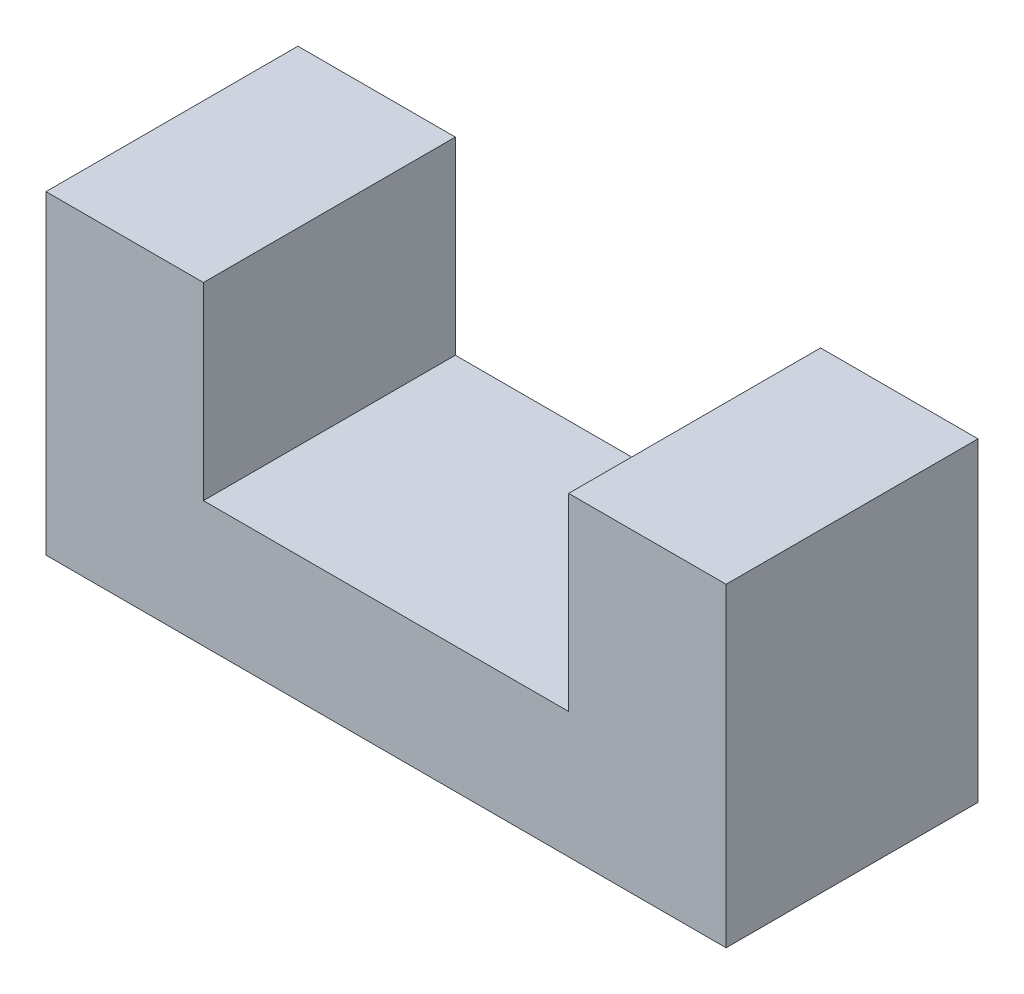
ISO-10303-21;
HEADER;
FILE_DESCRIPTION(('STEP AP214'),'2;1');
FILE_NAME('part.step','',(''),(''),'','','');
FILE_SCHEMA(('AUTOMOTIVE_DESIGN { 1 0 10303 214 1 1 1 1 }'));
ENDSEC;
DATA;
#1=APPLICATION_CONTEXT('core data for automotive mechanical design processes');
#2=APPLICATION_PROTOCOL_DEFINITION('international standard','automotive_design',2000,#1);
#3=PRODUCT_CONTEXT('',#1,'mechanical');
#4=PRODUCT('Part','Part','',(#3));
#5=PRODUCT_RELATED_PRODUCT_CATEGORY('part','',(#4));
#6=PRODUCT_DEFINITION_FORMATION('','',#4);
#7=PRODUCT_DEFINITION_CONTEXT('part definition',#1,'design');
#8=PRODUCT_DEFINITION('design','',#6,#7);
#9=PRODUCT_DEFINITION_SHAPE('','',#8);
#10=(LENGTH_UNIT() NAMED_UNIT(*) SI_UNIT(.MILLI.,.METRE.));
#11=(NAMED_UNIT(*) PLANE_ANGLE_UNIT() SI_UNIT($,.RADIAN.));
#12=(NAMED_UNIT(*) SI_UNIT($,.STERADIAN.) SOLID_ANGLE_UNIT());
#13=UNCERTAINTY_MEASURE_WITH_UNIT(LENGTH_MEASURE(1.E-05),#10,'distance_accuracy_value','');
#14=(GEOMETRIC_REPRESENTATION_CONTEXT(3) GLOBAL_UNCERTAINTY_ASSIGNED_CONTEXT((#13)) GLOBAL_UNIT_ASSIGNED_CONTEXT((#10,
#11,#12)) REPRESENTATION_CONTEXT('',''));
#15=CARTESIAN_POINT('',(0.,0.,0.));
#16=DIRECTION('',(0.,0.,1.));
#17=DIRECTION('',(1.,0.,0.));
#18=AXIS2_PLACEMENT_3D('',#15,#16,#17);
#19=CARTESIAN_POINT('',(0.,-2.,4.));
#20=DIRECTION('',(0.,1.,0.));
#21=DIRECTION('',(0.,0.,1.));
#22=AXIS2_PLACEMENT_3D('',#19,#20,#21);
#23=PLANE('',#22);
#24=DIRECTION('',(1.,0.,0.));
#25=VECTOR('',#24,1.);
#26=CARTESIAN_POINT('',(0.,-2.,0.));
#27=LINE('',#26,#25);
#28=CARTESIAN_POINT('',(-5.4,-2.,0.));
#29=VERTEX_POINT('',#28);
#30=CARTESIAN_POINT('',(5.4,-2.,0.));
#31=VERTEX_POINT('',#30);
#32=EDGE_CURVE('E131',#29,#31,#27,.T.);
#33=ORIENTED_EDGE('',*,*,#32,.T.);
#34=DIRECTION('',(0.,0.,-1.));
#35=VECTOR('',#34,1.);
#36=CARTESIAN_POINT('',(5.4,-2.,4.));
#37=LINE('',#36,#35);
#38=CARTESIAN_POINT('',(5.4,-2.,4.));
#39=VERTEX_POINT('',#38);
#40=EDGE_CURVE('E11',#39,#31,#37,.T.);
#41=ORIENTED_EDGE('',*,*,#40,.F.);
#42=DIRECTION('',(1.,0.,0.));
#43=VECTOR('',#42,1.);
#44=CARTESIAN_POINT('',(0.,-2.,4.));
#45=LINE('',#44,#43);
#46=CARTESIAN_POINT('',(-5.4,-2.,4.));
#47=VERTEX_POINT('',#46);
#48=EDGE_CURVE('E90',#47,#39,#45,.T.);
#49=ORIENTED_EDGE('',*,*,#48,.F.);
#50=DIRECTION('',(0.,0.,-1.));
#51=VECTOR('',#50,1.);
#52=CARTESIAN_POINT('',(-5.4,-2.,4.));
#53=LINE('',#52,#51);
#54=EDGE_CURVE('E130',#47,#29,#53,.T.);
#55=ORIENTED_EDGE('',*,*,#54,.T.);
#56=EDGE_LOOP('',(#33,#41,#49,#55));
#57=FACE_BOUND('',#56,.T.);
#58=ADVANCED_FACE('F35',(#57),#23,.F.);
#59=CARTESIAN_POINT('',(5.4,0.,4.));
#60=DIRECTION('',(1.,0.,0.));
#61=DIRECTION('',(0.,1.,0.));
#62=AXIS2_PLACEMENT_3D('',#59,#60,#61);
#63=PLANE('',#62);
#64=DIRECTION('',(0.,-1.,0.));
#65=VECTOR('',#64,1.);
#66=CARTESIAN_POINT('',(5.4,0.,0.));
#67=LINE('',#66,#65);
#68=CARTESIAN_POINT('',(5.4,3.,0.));
#69=VERTEX_POINT('',#68);
#70=EDGE_CURVE('E134',#69,#31,#67,.T.);
#71=ORIENTED_EDGE('',*,*,#70,.F.);
#72=DIRECTION('',(0.,0.,-1.));
#73=VECTOR('',#72,1.);
#74=CARTESIAN_POINT('',(5.4,3.,4.));
#75=LINE('',#74,#73);
#76=CARTESIAN_POINT('',(5.4,3.,4.));
#77=VERTEX_POINT('',#76);
#78=EDGE_CURVE('E43',#77,#69,#75,.T.);
#79=ORIENTED_EDGE('',*,*,#78,.F.);
#80=DIRECTION('',(0.,-1.,0.));
#81=VECTOR('',#80,1.);
#82=CARTESIAN_POINT('',(5.4,0.,4.));
#83=LINE('',#82,#81);
#84=EDGE_CURVE('E174',#77,#39,#83,.T.);
#85=ORIENTED_EDGE('',*,*,#84,.T.);
#86=ORIENTED_EDGE('',*,*,#40,.T.);
#87=EDGE_LOOP('',(#71,#79,#85,#86));
#88=FACE_BOUND('',#87,.T.);
#89=ADVANCED_FACE('F164',(#88),#63,.T.);
#90=CARTESIAN_POINT('',(0.,3.,4.));
#91=DIRECTION('',(0.,1.,0.));
#92=DIRECTION('',(0.,0.,1.));
#93=AXIS2_PLACEMENT_3D('',#90,#91,#92);
#94=PLANE('',#93);
#95=DIRECTION('',(1.,0.,0.));
#96=VECTOR('',#95,1.);
#97=CARTESIAN_POINT('',(0.,3.,0.));
#98=LINE('',#97,#96);
#99=CARTESIAN_POINT('',(2.9,3.,0.));
#100=VERTEX_POINT('',#99);
#101=EDGE_CURVE('E137',#100,#69,#98,.T.);
#102=ORIENTED_EDGE('',*,*,#101,.F.);
#103=DIRECTION('',(0.,0.,-1.));
#104=VECTOR('',#103,1.);
#105=CARTESIAN_POINT('',(2.9,3.,4.));
#106=LINE('',#105,#104);
#107=CARTESIAN_POINT('',(2.9,3.,4.));
#108=VERTEX_POINT('',#107);
#109=EDGE_CURVE('E154',#108,#100,#106,.T.);
#110=ORIENTED_EDGE('',*,*,#109,.F.);
#111=DIRECTION('',(1.,0.,0.));
#112=VECTOR('',#111,1.);
#113=CARTESIAN_POINT('',(0.,3.,4.));
#114=LINE('',#113,#112);
#115=EDGE_CURVE('E161',#108,#77,#114,.T.);
#116=ORIENTED_EDGE('',*,*,#115,.T.);
#117=ORIENTED_EDGE('',*,*,#78,.T.);
#118=EDGE_LOOP('',(#102,#110,#116,#117));
#119=FACE_BOUND('',#118,.T.);
#120=ADVANCED_FACE('F159',(#119),#94,.T.);
#121=CARTESIAN_POINT('',(2.9,0.,4.));
#122=DIRECTION('',(1.,0.,0.));
#123=DIRECTION('',(0.,1.,0.));
#124=AXIS2_PLACEMENT_3D('',#121,#122,#123);
#125=PLANE('',#124);
#126=DIRECTION('',(0.,-1.,0.));
#127=VECTOR('',#126,1.);
#128=CARTESIAN_POINT('',(2.9,0.,0.));
#129=LINE('',#128,#127);
#130=CARTESIAN_POINT('',(2.9,0.,0.));
#131=VERTEX_POINT('',#130);
#132=EDGE_CURVE('E140',#100,#131,#129,.T.);
#133=ORIENTED_EDGE('',*,*,#132,.T.);
#134=DIRECTION('',(0.,0.,-1.));
#135=VECTOR('',#134,1.);
#136=CARTESIAN_POINT('',(2.9,0.,4.));
#137=LINE('',#136,#135);
#138=CARTESIAN_POINT('',(2.9,0.,4.));
#139=VERTEX_POINT('',#138);
#140=EDGE_CURVE('E152',#139,#131,#137,.T.);
#141=ORIENTED_EDGE('',*,*,#140,.F.);
#142=DIRECTION('',(0.,-1.,0.));
#143=VECTOR('',#142,1.);
#144=CARTESIAN_POINT('',(2.9,0.,4.));
#145=LINE('',#144,#143);
#146=EDGE_CURVE('E125',#108,#139,#145,.T.);
#147=ORIENTED_EDGE('',*,*,#146,.F.);
#148=ORIENTED_EDGE('',*,*,#109,.T.);
#149=EDGE_LOOP('',(#133,#141,#147,#148));
#150=FACE_BOUND('',#149,.T.);
#151=ADVANCED_FACE('F172',(#150),#125,.F.);
#152=CARTESIAN_POINT('',(0.,0.,4.));
#153=DIRECTION('',(0.,1.,0.));
#154=DIRECTION('',(0.,0.,1.));
#155=AXIS2_PLACEMENT_3D('',#152,#153,#154);
#156=PLANE('',#155);
#157=DIRECTION('',(1.,0.,0.));
#158=VECTOR('',#157,1.);
#159=CARTESIAN_POINT('',(0.,0.,0.));
#160=LINE('',#159,#158);
#161=CARTESIAN_POINT('',(-2.9,0.,0.));
#162=VERTEX_POINT('',#161);
#163=EDGE_CURVE('E143',#162,#131,#160,.T.);
#164=ORIENTED_EDGE('',*,*,#163,.F.);
#165=DIRECTION('',(0.,0.,-1.));
#166=VECTOR('',#165,1.);
#167=CARTESIAN_POINT('',(-2.9,0.,4.));
#168=LINE('',#167,#166);
#169=CARTESIAN_POINT('',(-2.9,0.,4.));
#170=VERTEX_POINT('',#169);
#171=EDGE_CURVE('E114',#170,#162,#168,.T.);
#172=ORIENTED_EDGE('',*,*,#171,.F.);
#173=DIRECTION('',(1.,0.,0.));
#174=VECTOR('',#173,1.);
#175=CARTESIAN_POINT('',(0.,0.,4.));
#176=LINE('',#175,#174);
#177=EDGE_CURVE('E123',#170,#139,#176,.T.);
#178=ORIENTED_EDGE('',*,*,#177,.T.);
#179=ORIENTED_EDGE('',*,*,#140,.T.);
#180=EDGE_LOOP('',(#164,#172,#178,#179));
#181=FACE_BOUND('',#180,.T.);
#182=ADVANCED_FACE('F179',(#181),#156,.T.);
#183=CARTESIAN_POINT('',(-2.9,0.,4.));
#184=DIRECTION('',(1.,0.,0.));
#185=DIRECTION('',(0.,1.,0.));
#186=AXIS2_PLACEMENT_3D('',#183,#184,#185);
#187=PLANE('',#186);
#188=DIRECTION('',(0.,-1.,0.));
#189=VECTOR('',#188,1.);
#190=CARTESIAN_POINT('',(-2.9,0.,0.));
#191=LINE('',#190,#189);
#192=CARTESIAN_POINT('',(-2.9,3.,0.));
#193=VERTEX_POINT('',#192);
#194=EDGE_CURVE('E113',#193,#162,#191,.T.);
#195=ORIENTED_EDGE('',*,*,#194,.F.);
#196=DIRECTION('',(0.,0.,-1.));
#197=VECTOR('',#196,1.);
#198=CARTESIAN_POINT('',(-2.9,3.,4.));
#199=LINE('',#198,#197);
#200=CARTESIAN_POINT('',(-2.9,3.,4.));
#201=VERTEX_POINT('',#200);
#202=EDGE_CURVE('E107',#201,#193,#199,.T.);
#203=ORIENTED_EDGE('',*,*,#202,.F.);
#204=DIRECTION('',(0.,-1.,0.));
#205=VECTOR('',#204,1.);
#206=CARTESIAN_POINT('',(-2.9,0.,4.));
#207=LINE('',#206,#205);
#208=EDGE_CURVE('E111',#201,#170,#207,.T.);
#209=ORIENTED_EDGE('',*,*,#208,.T.);
#210=ORIENTED_EDGE('',*,*,#171,.T.);
#211=EDGE_LOOP('',(#195,#203,#209,#210));
#212=FACE_BOUND('',#211,.T.);
#213=ADVANCED_FACE('F109',(#212),#187,.T.);
#214=CARTESIAN_POINT('',(0.,3.,4.));
#215=DIRECTION('',(0.,-1.,0.));
#216=DIRECTION('',(0.,0.,-1.));
#217=AXIS2_PLACEMENT_3D('',#214,#215,#216);
#218=PLANE('',#217);
#219=DIRECTION('',(-1.,0.,0.));
#220=VECTOR('',#219,1.);
#221=CARTESIAN_POINT('',(0.,3.,0.));
#222=LINE('',#221,#220);
#223=CARTESIAN_POINT('',(-5.4,3.,0.));
#224=VERTEX_POINT('',#223);
#225=EDGE_CURVE('E78',#193,#224,#222,.T.);
#226=ORIENTED_EDGE('',*,*,#225,.T.);
#227=DIRECTION('',(0.,0.,-1.));
#228=VECTOR('',#227,1.);
#229=CARTESIAN_POINT('',(-5.4,3.,4.));
#230=LINE('',#229,#228);
#231=CARTESIAN_POINT('',(-5.4,3.,4.));
#232=VERTEX_POINT('',#231);
#233=EDGE_CURVE('E115',#232,#224,#230,.T.);
#234=ORIENTED_EDGE('',*,*,#233,.F.);
#235=DIRECTION('',(-1.,0.,0.));
#236=VECTOR('',#235,1.);
#237=CARTESIAN_POINT('',(0.,3.,4.));
#238=LINE('',#237,#236);
#239=EDGE_CURVE('E117',#201,#232,#238,.T.);
#240=ORIENTED_EDGE('',*,*,#239,.F.);
#241=ORIENTED_EDGE('',*,*,#202,.T.);
#242=EDGE_LOOP('',(#226,#234,#240,#241));
#243=FACE_BOUND('',#242,.T.);
#244=ADVANCED_FACE('F118',(#243),#218,.F.);
#245=CARTESIAN_POINT('',(-5.4,0.,4.));
#246=DIRECTION('',(1.,0.,0.));
#247=DIRECTION('',(0.,1.,0.));
#248=AXIS2_PLACEMENT_3D('',#245,#246,#247);
#249=PLANE('',#248);
#250=DIRECTION('',(0.,-1.,0.));
#251=VECTOR('',#250,1.);
#252=CARTESIAN_POINT('',(-5.4,0.,0.));
#253=LINE('',#252,#251);
#254=EDGE_CURVE('E84',#224,#29,#253,.T.);
#255=ORIENTED_EDGE('',*,*,#254,.T.);
#256=ORIENTED_EDGE('',*,*,#54,.F.);
#257=DIRECTION('',(0.,-1.,0.));
#258=VECTOR('',#257,1.);
#259=CARTESIAN_POINT('',(-5.4,0.,4.));
#260=LINE('',#259,#258);
#261=EDGE_CURVE('E51',#232,#47,#260,.T.);
#262=ORIENTED_EDGE('',*,*,#261,.F.);
#263=ORIENTED_EDGE('',*,*,#233,.T.);
#264=EDGE_LOOP('',(#255,#256,#262,#263));
#265=FACE_BOUND('',#264,.T.);
#266=ADVANCED_FACE('F181',(#265),#249,.F.);
#267=CARTESIAN_POINT('',(0.,0.,4.));
#268=DIRECTION('',(0.,0.,1.));
#269=DIRECTION('',(1.,0.,0.));
#270=AXIS2_PLACEMENT_3D('',#267,#268,#269);
#271=PLANE('',#270);
#272=ORIENTED_EDGE('',*,*,#48,.T.);
#273=ORIENTED_EDGE('',*,*,#84,.F.);
#274=ORIENTED_EDGE('',*,*,#115,.F.);
#275=ORIENTED_EDGE('',*,*,#146,.T.);
#276=ORIENTED_EDGE('',*,*,#177,.F.);
#277=ORIENTED_EDGE('',*,*,#208,.F.);
#278=ORIENTED_EDGE('',*,*,#239,.T.);
#279=ORIENTED_EDGE('',*,*,#261,.T.);
#280=EDGE_LOOP('',(#272,#273,#274,#275,#276,#277,#278,#279));
#281=FACE_BOUND('',#280,.T.);
#282=ADVANCED_FACE('F121',(#281),#271,.T.);
#283=CARTESIAN_POINT('',(0.,0.,0.));
#284=DIRECTION('',(0.,0.,1.));
#285=DIRECTION('',(1.,0.,0.));
#286=AXIS2_PLACEMENT_3D('',#283,#284,#285);
#287=PLANE('',#286);
#288=ORIENTED_EDGE('',*,*,#32,.F.);
#289=ORIENTED_EDGE('',*,*,#254,.F.);
#290=ORIENTED_EDGE('',*,*,#225,.F.);
#291=ORIENTED_EDGE('',*,*,#194,.T.);
#292=ORIENTED_EDGE('',*,*,#163,.T.);
#293=ORIENTED_EDGE('',*,*,#132,.F.);
#294=ORIENTED_EDGE('',*,*,#101,.T.);
#295=ORIENTED_EDGE('',*,*,#70,.T.);
#296=EDGE_LOOP('',(#288,#289,#290,#291,#292,#293,#294,#295));
#297=FACE_BOUND('',#296,.T.);
#298=ADVANCED_FACE('F168',(#297),#287,.F.);
#299=CLOSED_SHELL('',(#58,#89,#120,#151,#182,#213,#244,#266,#282,#298));
#300=MANIFOLD_SOLID_BREP('B2',#299);
#301=ADVANCED_BREP_SHAPE_REPRESENTATION('',(#18,#300),#14);
#302=SHAPE_DEFINITION_REPRESENTATION(#9,#301);
ENDSEC;
END-ISO-10303-21;
